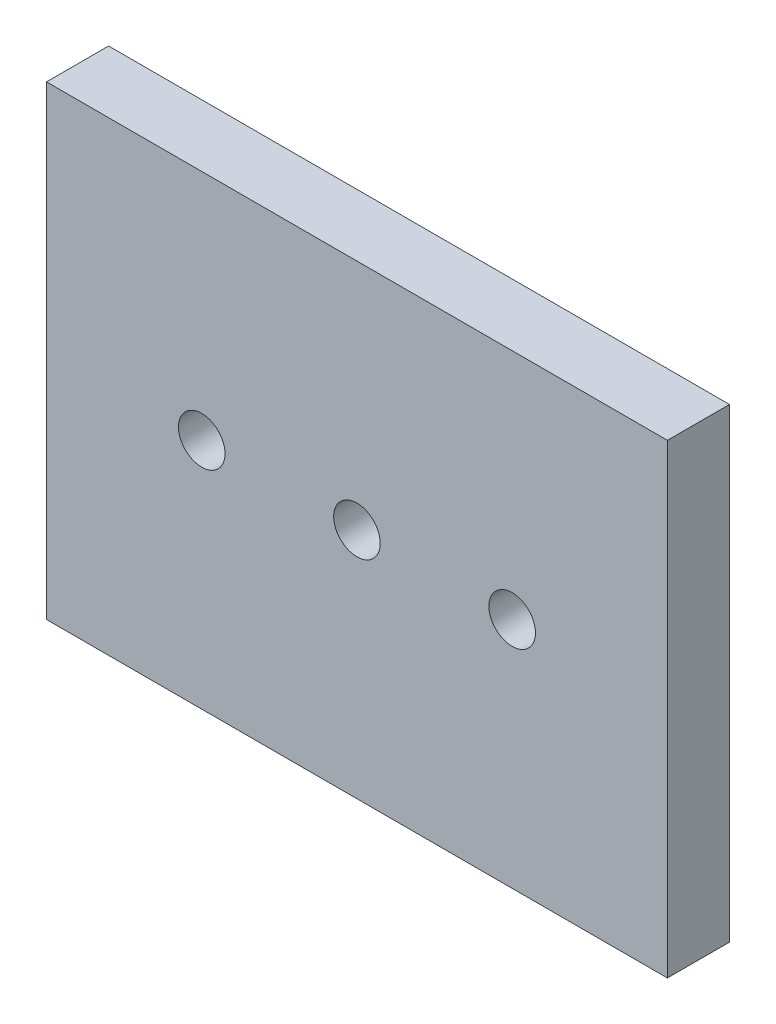
ISO-10303-21;
HEADER;
FILE_DESCRIPTION(('STEP AP214'),'2;1');
FILE_NAME('part.step','',(''),(''),'','','');
FILE_SCHEMA(('AUTOMOTIVE_DESIGN { 1 0 10303 214 1 1 1 1 }'));
ENDSEC;
DATA;
#1=APPLICATION_CONTEXT('core data for automotive mechanical design processes');
#2=APPLICATION_PROTOCOL_DEFINITION('international standard','automotive_design',2000,#1);
#3=PRODUCT_CONTEXT('',#1,'mechanical');
#4=PRODUCT('Part','Part','',(#3));
#5=PRODUCT_RELATED_PRODUCT_CATEGORY('part','',(#4));
#6=PRODUCT_DEFINITION_FORMATION('','',#4);
#7=PRODUCT_DEFINITION_CONTEXT('part definition',#1,'design');
#8=PRODUCT_DEFINITION('design','',#6,#7);
#9=PRODUCT_DEFINITION_SHAPE('','',#8);
#10=(LENGTH_UNIT() NAMED_UNIT(*) SI_UNIT(.MILLI.,.METRE.));
#11=(NAMED_UNIT(*) PLANE_ANGLE_UNIT() SI_UNIT($,.RADIAN.));
#12=(NAMED_UNIT(*) SI_UNIT($,.STERADIAN.) SOLID_ANGLE_UNIT());
#13=UNCERTAINTY_MEASURE_WITH_UNIT(LENGTH_MEASURE(1.E-05),#10,'distance_accuracy_value','');
#14=(GEOMETRIC_REPRESENTATION_CONTEXT(3) GLOBAL_UNCERTAINTY_ASSIGNED_CONTEXT((#13)) GLOBAL_UNIT_ASSIGNED_CONTEXT((#10,
#11,#12)) REPRESENTATION_CONTEXT('',''));
#15=CARTESIAN_POINT('',(0.,0.,0.));
#16=DIRECTION('',(0.,0.,1.));
#17=DIRECTION('',(1.,0.,0.));
#18=AXIS2_PLACEMENT_3D('',#15,#16,#17);
#19=CARTESIAN_POINT('',(-20.,15.,4.));
#20=DIRECTION('',(1.,0.,0.));
#21=DIRECTION('',(0.,1.,0.));
#22=AXIS2_PLACEMENT_3D('',#19,#20,#21);
#23=PLANE('',#22);
#24=DIRECTION('',(0.,-1.,0.));
#25=VECTOR('',#24,1.);
#26=CARTESIAN_POINT('',(-20.,15.,0.));
#27=LINE('',#26,#25);
#28=CARTESIAN_POINT('',(-20.,15.,0.));
#29=VERTEX_POINT('',#28);
#30=CARTESIAN_POINT('',(-20.,-15.,0.));
#31=VERTEX_POINT('',#30);
#32=EDGE_CURVE('E94',#29,#31,#27,.T.);
#33=ORIENTED_EDGE('',*,*,#32,.T.);
#34=DIRECTION('',(0.,0.,-1.));
#35=VECTOR('',#34,1.);
#36=CARTESIAN_POINT('',(-20.,-15.,4.));
#37=LINE('',#36,#35);
#38=CARTESIAN_POINT('',(-20.,-15.,4.));
#39=VERTEX_POINT('',#38);
#40=EDGE_CURVE('E11',#39,#31,#37,.T.);
#41=ORIENTED_EDGE('',*,*,#40,.F.);
#42=DIRECTION('',(0.,-1.,0.));
#43=VECTOR('',#42,1.);
#44=CARTESIAN_POINT('',(-20.,15.,4.));
#45=LINE('',#44,#43);
#46=CARTESIAN_POINT('',(-20.,15.,4.));
#47=VERTEX_POINT('',#46);
#48=EDGE_CURVE('E82',#47,#39,#45,.T.);
#49=ORIENTED_EDGE('',*,*,#48,.F.);
#50=DIRECTION('',(0.,0.,-1.));
#51=VECTOR('',#50,1.);
#52=CARTESIAN_POINT('',(-20.,15.,4.));
#53=LINE('',#52,#51);
#54=EDGE_CURVE('E90',#47,#29,#53,.T.);
#55=ORIENTED_EDGE('',*,*,#54,.T.);
#56=EDGE_LOOP('',(#33,#41,#49,#55));
#57=FACE_BOUND('',#56,.T.);
#58=ADVANCED_FACE('F31',(#57),#23,.F.);
#59=CARTESIAN_POINT('',(-20.,-15.,4.));
#60=DIRECTION('',(0.,1.,0.));
#61=DIRECTION('',(0.,0.,1.));
#62=AXIS2_PLACEMENT_3D('',#59,#60,#61);
#63=PLANE('',#62);
#64=DIRECTION('',(1.,0.,0.));
#65=VECTOR('',#64,1.);
#66=CARTESIAN_POINT('',(-20.,-15.,0.));
#67=LINE('',#66,#65);
#68=CARTESIAN_POINT('',(20.,-15.,0.));
#69=VERTEX_POINT('',#68);
#70=EDGE_CURVE('E86',#31,#69,#67,.T.);
#71=ORIENTED_EDGE('',*,*,#70,.T.);
#72=DIRECTION('',(0.,0.,-1.));
#73=VECTOR('',#72,1.);
#74=CARTESIAN_POINT('',(20.,-15.,4.));
#75=LINE('',#74,#73);
#76=CARTESIAN_POINT('',(20.,-15.,4.));
#77=VERTEX_POINT('',#76);
#78=EDGE_CURVE('E39',#77,#69,#75,.T.);
#79=ORIENTED_EDGE('',*,*,#78,.F.);
#80=DIRECTION('',(1.,0.,0.));
#81=VECTOR('',#80,1.);
#82=CARTESIAN_POINT('',(-20.,-15.,4.));
#83=LINE('',#82,#81);
#84=EDGE_CURVE('E77',#39,#77,#83,.T.);
#85=ORIENTED_EDGE('',*,*,#84,.F.);
#86=ORIENTED_EDGE('',*,*,#40,.T.);
#87=EDGE_LOOP('',(#71,#79,#85,#86));
#88=FACE_BOUND('',#87,.T.);
#89=ADVANCED_FACE('F85',(#88),#63,.F.);
#90=CARTESIAN_POINT('',(20.,15.,4.));
#91=DIRECTION('',(-1.,0.,0.));
#92=DIRECTION('',(0.,0.,1.));
#93=AXIS2_PLACEMENT_3D('',#90,#91,#92);
#94=PLANE('',#93);
#95=DIRECTION('',(0.,1.,0.));
#96=VECTOR('',#95,1.);
#97=CARTESIAN_POINT('',(20.,15.,0.));
#98=LINE('',#97,#96);
#99=CARTESIAN_POINT('',(20.,15.,0.));
#100=VERTEX_POINT('',#99);
#101=EDGE_CURVE('E64',#69,#100,#98,.T.);
#102=ORIENTED_EDGE('',*,*,#101,.T.);
#103=DIRECTION('',(0.,0.,-1.));
#104=VECTOR('',#103,1.);
#105=CARTESIAN_POINT('',(20.,15.,4.));
#106=LINE('',#105,#104);
#107=CARTESIAN_POINT('',(20.,15.,4.));
#108=VERTEX_POINT('',#107);
#109=EDGE_CURVE('E87',#108,#100,#106,.T.);
#110=ORIENTED_EDGE('',*,*,#109,.F.);
#111=DIRECTION('',(0.,1.,0.));
#112=VECTOR('',#111,1.);
#113=CARTESIAN_POINT('',(20.,15.,4.));
#114=LINE('',#113,#112);
#115=EDGE_CURVE('E80',#77,#108,#114,.T.);
#116=ORIENTED_EDGE('',*,*,#115,.F.);
#117=ORIENTED_EDGE('',*,*,#78,.T.);
#118=EDGE_LOOP('',(#102,#110,#116,#117));
#119=FACE_BOUND('',#118,.T.);
#120=ADVANCED_FACE('F88',(#119),#94,.F.);
#121=CARTESIAN_POINT('',(-20.,15.,4.));
#122=DIRECTION('',(0.,-1.,0.));
#123=DIRECTION('',(0.,0.,-1.));
#124=AXIS2_PLACEMENT_3D('',#121,#122,#123);
#125=PLANE('',#124);
#126=DIRECTION('',(-1.,0.,0.));
#127=VECTOR('',#126,1.);
#128=CARTESIAN_POINT('',(-20.,15.,0.));
#129=LINE('',#128,#127);
#130=EDGE_CURVE('E70',#100,#29,#129,.T.);
#131=ORIENTED_EDGE('',*,*,#130,.T.);
#132=ORIENTED_EDGE('',*,*,#54,.F.);
#133=DIRECTION('',(-1.,0.,0.));
#134=VECTOR('',#133,1.);
#135=CARTESIAN_POINT('',(-20.,15.,4.));
#136=LINE('',#135,#134);
#137=EDGE_CURVE('E47',#108,#47,#136,.T.);
#138=ORIENTED_EDGE('',*,*,#137,.F.);
#139=ORIENTED_EDGE('',*,*,#109,.T.);
#140=EDGE_LOOP('',(#131,#132,#138,#139));
#141=FACE_BOUND('',#140,.T.);
#142=ADVANCED_FACE('F102',(#141),#125,.F.);
#143=CARTESIAN_POINT('',(-20.,-15.,4.));
#144=DIRECTION('',(0.,0.,1.));
#145=DIRECTION('',(1.,0.,0.));
#146=AXIS2_PLACEMENT_3D('',#143,#144,#145);
#147=PLANE('',#146);
#148=CARTESIAN_POINT('',(10.,0.,4.));
#149=DIRECTION('',(0.,0.,1.));
#150=DIRECTION('',(1.,0.,0.));
#151=AXIS2_PLACEMENT_3D('',#148,#149,#150);
#152=CIRCLE('',#151,1.5);
#153=CARTESIAN_POINT('',(11.5,0.,4.));
#154=VERTEX_POINT('',#153);
#155=EDGE_CURVE('E122',#154,#154,#152,.T.);
#156=ORIENTED_EDGE('',*,*,#155,.F.);
#157=EDGE_LOOP('',(#156));
#158=FACE_BOUND('',#157,.T.);
#159=CARTESIAN_POINT('',(-10.,0.,4.));
#160=DIRECTION('',(0.,0.,1.));
#161=DIRECTION('',(1.,0.,0.));
#162=AXIS2_PLACEMENT_3D('',#159,#160,#161);
#163=CIRCLE('',#162,1.5);
#164=CARTESIAN_POINT('',(-8.5,0.,4.));
#165=VERTEX_POINT('',#164);
#166=EDGE_CURVE('E116',#165,#165,#163,.T.);
#167=ORIENTED_EDGE('',*,*,#166,.F.);
#168=EDGE_LOOP('',(#167));
#169=FACE_BOUND('',#168,.T.);
#170=CARTESIAN_POINT('',(0.,0.,4.));
#171=DIRECTION('',(0.,0.,1.));
#172=DIRECTION('',(1.,0.,0.));
#173=AXIS2_PLACEMENT_3D('',#170,#171,#172);
#174=CIRCLE('',#173,1.5);
#175=CARTESIAN_POINT('',(1.5,0.,4.));
#176=VERTEX_POINT('',#175);
#177=EDGE_CURVE('E110',#176,#176,#174,.T.);
#178=ORIENTED_EDGE('',*,*,#177,.F.);
#179=EDGE_LOOP('',(#178));
#180=FACE_BOUND('',#179,.T.);
#181=ORIENTED_EDGE('',*,*,#48,.T.);
#182=ORIENTED_EDGE('',*,*,#84,.T.);
#183=ORIENTED_EDGE('',*,*,#115,.T.);
#184=ORIENTED_EDGE('',*,*,#137,.T.);
#185=EDGE_LOOP('',(#181,#182,#183,#184));
#186=FACE_BOUND('',#185,.T.);
#187=ADVANCED_FACE('F78',(#158,#169,#180,#186),#147,.T.);
#188=CARTESIAN_POINT('',(-20.,-15.,0.));
#189=DIRECTION('',(0.,0.,1.));
#190=DIRECTION('',(1.,0.,0.));
#191=AXIS2_PLACEMENT_3D('',#188,#189,#190);
#192=PLANE('',#191);
#193=CARTESIAN_POINT('',(10.,0.,0.));
#194=DIRECTION('',(0.,0.,1.));
#195=DIRECTION('',(1.,0.,0.));
#196=AXIS2_PLACEMENT_3D('',#193,#194,#195);
#197=CIRCLE('',#196,1.5);
#198=CARTESIAN_POINT('',(11.5,0.,0.));
#199=VERTEX_POINT('',#198);
#200=EDGE_CURVE('E119',#199,#199,#197,.F.);
#201=ORIENTED_EDGE('',*,*,#200,.F.);
#202=EDGE_LOOP('',(#201));
#203=FACE_BOUND('',#202,.T.);
#204=CARTESIAN_POINT('',(-10.,0.,0.));
#205=DIRECTION('',(0.,0.,1.));
#206=DIRECTION('',(1.,0.,0.));
#207=AXIS2_PLACEMENT_3D('',#204,#205,#206);
#208=CIRCLE('',#207,1.5);
#209=CARTESIAN_POINT('',(-8.5,0.,0.));
#210=VERTEX_POINT('',#209);
#211=EDGE_CURVE('E113',#210,#210,#208,.F.);
#212=ORIENTED_EDGE('',*,*,#211,.F.);
#213=EDGE_LOOP('',(#212));
#214=FACE_BOUND('',#213,.T.);
#215=CARTESIAN_POINT('',(0.,0.,0.));
#216=DIRECTION('',(0.,0.,1.));
#217=DIRECTION('',(1.,0.,0.));
#218=AXIS2_PLACEMENT_3D('',#215,#216,#217);
#219=CIRCLE('',#218,1.5);
#220=CARTESIAN_POINT('',(1.5,0.,0.));
#221=VERTEX_POINT('',#220);
#222=EDGE_CURVE('E97',#221,#221,#219,.F.);
#223=ORIENTED_EDGE('',*,*,#222,.F.);
#224=EDGE_LOOP('',(#223));
#225=FACE_BOUND('',#224,.T.);
#226=ORIENTED_EDGE('',*,*,#32,.F.);
#227=ORIENTED_EDGE('',*,*,#130,.F.);
#228=ORIENTED_EDGE('',*,*,#101,.F.);
#229=ORIENTED_EDGE('',*,*,#70,.F.);
#230=EDGE_LOOP('',(#226,#227,#228,#229));
#231=FACE_BOUND('',#230,.T.);
#232=ADVANCED_FACE('F105',(#203,#214,#225,#231),#192,.F.);
#233=CARTESIAN_POINT('',(0.,0.,-0.00100000000000013));
#234=DIRECTION('',(0.,0.,1.));
#235=DIRECTION('',(1.,0.,0.));
#236=AXIS2_PLACEMENT_3D('',#233,#234,#235);
#237=CYLINDRICAL_SURFACE('',#236,1.5);
#238=ORIENTED_EDGE('',*,*,#177,.T.);
#239=EDGE_LOOP('',(#238));
#240=FACE_BOUND('',#239,.T.);
#241=ORIENTED_EDGE('',*,*,#222,.T.);
#242=EDGE_LOOP('',(#241));
#243=FACE_BOUND('',#242,.T.);
#244=ADVANCED_FACE('F136',(#240,#243),#237,.F.);
#245=CARTESIAN_POINT('',(-10.,0.,-0.00100000000000013));
#246=DIRECTION('',(0.,0.,1.));
#247=DIRECTION('',(1.,0.,0.));
#248=AXIS2_PLACEMENT_3D('',#245,#246,#247);
#249=CYLINDRICAL_SURFACE('',#248,1.5);
#250=ORIENTED_EDGE('',*,*,#166,.T.);
#251=EDGE_LOOP('',(#250));
#252=FACE_BOUND('',#251,.T.);
#253=ORIENTED_EDGE('',*,*,#211,.T.);
#254=EDGE_LOOP('',(#253));
#255=FACE_BOUND('',#254,.T.);
#256=ADVANCED_FACE('F139',(#252,#255),#249,.F.);
#257=CARTESIAN_POINT('',(10.,0.,-0.00100000000000013));
#258=DIRECTION('',(0.,0.,1.));
#259=DIRECTION('',(1.,0.,0.));
#260=AXIS2_PLACEMENT_3D('',#257,#258,#259);
#261=CYLINDRICAL_SURFACE('',#260,1.5);
#262=ORIENTED_EDGE('',*,*,#155,.T.);
#263=EDGE_LOOP('',(#262));
#264=FACE_BOUND('',#263,.T.);
#265=ORIENTED_EDGE('',*,*,#200,.T.);
#266=EDGE_LOOP('',(#265));
#267=FACE_BOUND('',#266,.T.);
#268=ADVANCED_FACE('F126',(#264,#267),#261,.F.);
#269=CLOSED_SHELL('',(#58,#89,#120,#142,#187,#232,#244,#256,#268));
#270=MANIFOLD_SOLID_BREP('B2',#269);
#271=ADVANCED_BREP_SHAPE_REPRESENTATION('',(#18,#270),#14);
#272=SHAPE_DEFINITION_REPRESENTATION(#9,#271);
ENDSEC;
END-ISO-10303-21;
